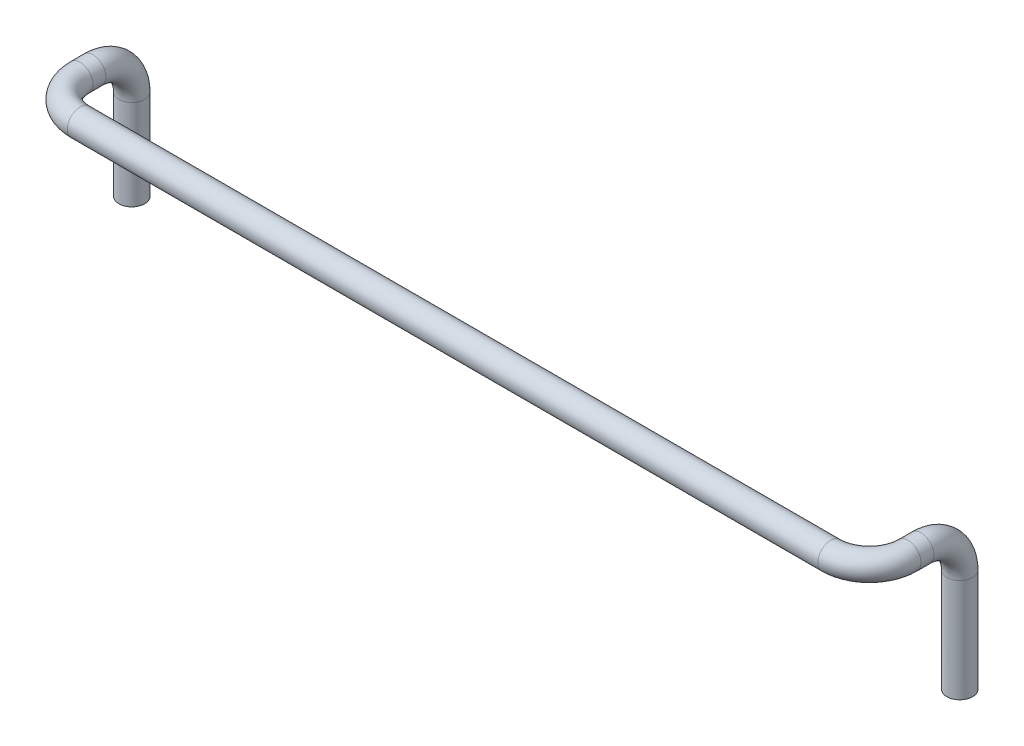
ISO-10303-21;
HEADER;
FILE_DESCRIPTION(('STEP AP214'),'2;1');
FILE_NAME('part.step','',(''),(''),'','','');
FILE_SCHEMA(('AUTOMOTIVE_DESIGN { 1 0 10303 214 1 1 1 1 }'));
ENDSEC;
DATA;
#1=APPLICATION_CONTEXT('core data for automotive mechanical design processes');
#2=APPLICATION_PROTOCOL_DEFINITION('international standard','automotive_design',2000,#1);
#3=PRODUCT_CONTEXT('',#1,'mechanical');
#4=PRODUCT('Part','Part','',(#3));
#5=PRODUCT_RELATED_PRODUCT_CATEGORY('part','',(#4));
#6=PRODUCT_DEFINITION_FORMATION('','',#4);
#7=PRODUCT_DEFINITION_CONTEXT('part definition',#1,'design');
#8=PRODUCT_DEFINITION('design','',#6,#7);
#9=PRODUCT_DEFINITION_SHAPE('','',#8);
#10=(LENGTH_UNIT() NAMED_UNIT(*) SI_UNIT(.MILLI.,.METRE.));
#11=(NAMED_UNIT(*) PLANE_ANGLE_UNIT() SI_UNIT($,.RADIAN.));
#12=(NAMED_UNIT(*) SI_UNIT($,.STERADIAN.) SOLID_ANGLE_UNIT());
#13=UNCERTAINTY_MEASURE_WITH_UNIT(LENGTH_MEASURE(1.E-05),#10,'distance_accuracy_value','');
#14=(GEOMETRIC_REPRESENTATION_CONTEXT(3) GLOBAL_UNCERTAINTY_ASSIGNED_CONTEXT((#13)) GLOBAL_UNIT_ASSIGNED_CONTEXT((#10,
#11,#12)) REPRESENTATION_CONTEXT('',''));
#15=CARTESIAN_POINT('',(0.,0.,0.));
#16=DIRECTION('',(0.,0.,1.));
#17=DIRECTION('',(1.,0.,0.));
#18=AXIS2_PLACEMENT_3D('',#15,#16,#17);
#19=CARTESIAN_POINT('',(63.1414630173547,-3.,-3.));
#20=DIRECTION('',(0.,-1.,0.));
#21=DIRECTION('',(0.,0.,-1.));
#22=AXIS2_PLACEMENT_3D('',#19,#20,#21);
#23=CYLINDRICAL_SURFACE('',#22,1.);
#24=CARTESIAN_POINT('',(63.1414630173547,-3.,-3.));
#25=DIRECTION('',(0.,-1.,0.));
#26=DIRECTION('',(0.,0.,1.));
#27=AXIS2_PLACEMENT_3D('',#24,#25,#26);
#28=CIRCLE('',#27,1.);
#29=CARTESIAN_POINT('',(63.1414630173547,-3.,-4.));
#30=VERTEX_POINT('',#29);
#31=EDGE_CURVE('E35',#30,#30,#28,.T.);
#32=ORIENTED_EDGE('',*,*,#31,.T.);
#33=EDGE_LOOP('',(#32));
#34=FACE_BOUND('',#33,.T.);
#35=CARTESIAN_POINT('',(63.1414630173547,-11.,-3.));
#36=DIRECTION('',(0.,-1.,0.));
#37=DIRECTION('',(0.,0.,1.));
#38=AXIS2_PLACEMENT_3D('',#35,#36,#37);
#39=CIRCLE('',#38,1.);
#40=CARTESIAN_POINT('',(63.1414630173547,-11.,-2.));
#41=VERTEX_POINT('',#40);
#42=EDGE_CURVE('E10',#41,#41,#39,.T.);
#43=ORIENTED_EDGE('',*,*,#42,.F.);
#44=EDGE_LOOP('',(#43));
#45=FACE_BOUND('',#44,.T.);
#46=ADVANCED_FACE('F29',(#34,#45),#23,.T.);
#47=CARTESIAN_POINT('',(63.1414630173547,-3.,0.));
#48=DIRECTION('',(-1.,0.,0.));
#49=DIRECTION('',(0.,0.,1.));
#50=AXIS2_PLACEMENT_3D('',#47,#48,#49);
#51=TOROIDAL_SURFACE('',#50,3.,1.);
#52=CARTESIAN_POINT('',(63.1414630173547,0.,0.));
#53=DIRECTION('',(0.,0.,-1.));
#54=DIRECTION('',(0.,-1.,0.));
#55=AXIS2_PLACEMENT_3D('',#52,#53,#54);
#56=CIRCLE('',#55,1.);
#57=CARTESIAN_POINT('',(63.1414630173547,1.,0.));
#58=VERTEX_POINT('',#57);
#59=EDGE_CURVE('E39',#58,#58,#56,.T.);
#60=CARTESIAN_POINT('',(63.1414630173547,-3.,0.));
#61=DIRECTION('',(-1.,0.,0.));
#62=DIRECTION('',(0.,0.,1.));
#63=AXIS2_PLACEMENT_3D('',#60,#61,#62);
#64=CIRCLE('',#63,4.);
#65=EDGE_CURVE('',#58,#30,#64,.T.);
#66=ORIENTED_EDGE('',*,*,#59,.T.);
#67=ORIENTED_EDGE('',*,*,#31,.F.);
#68=ORIENTED_EDGE('',*,*,#65,.T.);
#69=ORIENTED_EDGE('',*,*,#65,.F.);
#70=EDGE_LOOP('',(#66,#68,#67,#69));
#71=FACE_BOUND('',#70,.T.);
#72=ADVANCED_FACE('F85',(#71),#51,.T.);
#73=CARTESIAN_POINT('',(63.1414630173547,0.,1.));
#74=DIRECTION('',(0.,0.,-1.));
#75=DIRECTION('',(-1.,0.,0.));
#76=AXIS2_PLACEMENT_3D('',#73,#74,#75);
#77=CYLINDRICAL_SURFACE('',#76,1.);
#78=CARTESIAN_POINT('',(63.1414630173547,0.,1.));
#79=DIRECTION('',(0.,0.,-1.));
#80=DIRECTION('',(0.,-1.,0.));
#81=AXIS2_PLACEMENT_3D('',#78,#79,#80);
#82=CIRCLE('',#81,1.);
#83=CARTESIAN_POINT('',(64.1414630173547,0.,1.));
#84=VERTEX_POINT('',#83);
#85=EDGE_CURVE('E43',#84,#84,#82,.T.);
#86=ORIENTED_EDGE('',*,*,#85,.T.);
#87=EDGE_LOOP('',(#86));
#88=FACE_BOUND('',#87,.T.);
#89=ORIENTED_EDGE('',*,*,#59,.F.);
#90=EDGE_LOOP('',(#89));
#91=FACE_BOUND('',#90,.T.);
#92=ADVANCED_FACE('F89',(#88,#91),#77,.T.);
#93=CARTESIAN_POINT('',(60.1414630173547,0.,1.));
#94=DIRECTION('',(0.,1.,0.));
#95=DIRECTION('',(0.,0.,1.));
#96=AXIS2_PLACEMENT_3D('',#93,#94,#95);
#97=TOROIDAL_SURFACE('',#96,3.,1.);
#98=CARTESIAN_POINT('',(60.1414630173547,0.,4.));
#99=DIRECTION('',(1.,0.,0.));
#100=DIRECTION('',(0.,-1.,0.));
#101=AXIS2_PLACEMENT_3D('',#98,#99,#100);
#102=CIRCLE('',#101,1.);
#103=CARTESIAN_POINT('',(60.1414630173547,0.,5.));
#104=VERTEX_POINT('',#103);
#105=EDGE_CURVE('E48',#104,#104,#102,.T.);
#106=CARTESIAN_POINT('',(60.1414630173547,0.,1.));
#107=DIRECTION('',(0.,1.,0.));
#108=DIRECTION('',(0.,0.,1.));
#109=AXIS2_PLACEMENT_3D('',#106,#107,#108);
#110=CIRCLE('',#109,4.);
#111=EDGE_CURVE('',#104,#84,#110,.T.);
#112=ORIENTED_EDGE('',*,*,#105,.T.);
#113=ORIENTED_EDGE('',*,*,#85,.F.);
#114=ORIENTED_EDGE('',*,*,#111,.T.);
#115=ORIENTED_EDGE('',*,*,#111,.F.);
#116=EDGE_LOOP('',(#112,#114,#113,#115));
#117=FACE_BOUND('',#116,.T.);
#118=ADVANCED_FACE('F95',(#117),#97,.T.);
#119=CARTESIAN_POINT('',(2.,0.,4.));
#120=DIRECTION('',(1.,0.,0.));
#121=DIRECTION('',(0.,0.,-1.));
#122=AXIS2_PLACEMENT_3D('',#119,#120,#121);
#123=CYLINDRICAL_SURFACE('',#122,1.);
#124=CARTESIAN_POINT('',(2.,0.,4.));
#125=DIRECTION('',(1.,0.,0.));
#126=DIRECTION('',(0.,-1.,0.));
#127=AXIS2_PLACEMENT_3D('',#124,#125,#126);
#128=CIRCLE('',#127,1.);
#129=CARTESIAN_POINT('',(2.,0.,5.));
#130=VERTEX_POINT('',#129);
#131=EDGE_CURVE('E51',#130,#130,#128,.T.);
#132=ORIENTED_EDGE('',*,*,#131,.T.);
#133=EDGE_LOOP('',(#132));
#134=FACE_BOUND('',#133,.T.);
#135=ORIENTED_EDGE('',*,*,#105,.F.);
#136=EDGE_LOOP('',(#135));
#137=FACE_BOUND('',#136,.T.);
#138=ADVANCED_FACE('F102',(#134,#137),#123,.T.);
#139=CARTESIAN_POINT('',(2.,0.,1.));
#140=DIRECTION('',(0.,1.,0.));
#141=DIRECTION('',(0.,0.,1.));
#142=AXIS2_PLACEMENT_3D('',#139,#140,#141);
#143=TOROIDAL_SURFACE('',#142,3.,1.);
#144=CARTESIAN_POINT('',(-1.,0.,1.));
#145=DIRECTION('',(0.,0.,1.));
#146=DIRECTION('',(0.,-1.,0.));
#147=AXIS2_PLACEMENT_3D('',#144,#145,#146);
#148=CIRCLE('',#147,1.);
#149=CARTESIAN_POINT('',(-2.,0.,1.));
#150=VERTEX_POINT('',#149);
#151=EDGE_CURVE('E54',#150,#150,#148,.T.);
#152=CARTESIAN_POINT('',(2.,0.,1.));
#153=DIRECTION('',(0.,1.,0.));
#154=DIRECTION('',(0.,0.,1.));
#155=AXIS2_PLACEMENT_3D('',#152,#153,#154);
#156=CIRCLE('',#155,4.);
#157=EDGE_CURVE('',#150,#130,#156,.T.);
#158=ORIENTED_EDGE('',*,*,#151,.T.);
#159=ORIENTED_EDGE('',*,*,#131,.F.);
#160=ORIENTED_EDGE('',*,*,#157,.T.);
#161=ORIENTED_EDGE('',*,*,#157,.F.);
#162=EDGE_LOOP('',(#158,#160,#159,#161));
#163=FACE_BOUND('',#162,.T.);
#164=ADVANCED_FACE('F106',(#163),#143,.T.);
#165=CARTESIAN_POINT('',(-1.,0.,0.));
#166=DIRECTION('',(0.,0.,1.));
#167=DIRECTION('',(1.,0.,0.));
#168=AXIS2_PLACEMENT_3D('',#165,#166,#167);
#169=CYLINDRICAL_SURFACE('',#168,1.);
#170=CARTESIAN_POINT('',(-1.,0.,0.));
#171=DIRECTION('',(0.,0.,1.));
#172=DIRECTION('',(0.,-1.,0.));
#173=AXIS2_PLACEMENT_3D('',#170,#171,#172);
#174=CIRCLE('',#173,1.);
#175=CARTESIAN_POINT('',(-1.,1.,0.));
#176=VERTEX_POINT('',#175);
#177=EDGE_CURVE('E57',#176,#176,#174,.T.);
#178=ORIENTED_EDGE('',*,*,#177,.T.);
#179=EDGE_LOOP('',(#178));
#180=FACE_BOUND('',#179,.T.);
#181=ORIENTED_EDGE('',*,*,#151,.F.);
#182=EDGE_LOOP('',(#181));
#183=FACE_BOUND('',#182,.T.);
#184=ADVANCED_FACE('F110',(#180,#183),#169,.T.);
#185=CARTESIAN_POINT('',(-1.,-3.,0.));
#186=DIRECTION('',(1.,0.,0.));
#187=DIRECTION('',(0.,0.,-1.));
#188=AXIS2_PLACEMENT_3D('',#185,#186,#187);
#189=TOROIDAL_SURFACE('',#188,3.,1.);
#190=CARTESIAN_POINT('',(-1.,-3.,-3.));
#191=DIRECTION('',(0.,1.,0.));
#192=DIRECTION('',(0.,0.,1.));
#193=AXIS2_PLACEMENT_3D('',#190,#191,#192);
#194=CIRCLE('',#193,1.);
#195=CARTESIAN_POINT('',(-1.,-3.,-4.));
#196=VERTEX_POINT('',#195);
#197=EDGE_CURVE('E60',#196,#196,#194,.T.);
#198=CARTESIAN_POINT('',(-1.,-3.,0.));
#199=DIRECTION('',(1.,0.,0.));
#200=DIRECTION('',(0.,0.,-1.));
#201=AXIS2_PLACEMENT_3D('',#198,#199,#200);
#202=CIRCLE('',#201,4.);
#203=EDGE_CURVE('',#196,#176,#202,.T.);
#204=ORIENTED_EDGE('',*,*,#197,.T.);
#205=ORIENTED_EDGE('',*,*,#177,.F.);
#206=ORIENTED_EDGE('',*,*,#203,.T.);
#207=ORIENTED_EDGE('',*,*,#203,.F.);
#208=EDGE_LOOP('',(#204,#206,#205,#207));
#209=FACE_BOUND('',#208,.T.);
#210=ADVANCED_FACE('F67',(#209),#189,.T.);
#211=CARTESIAN_POINT('',(-1.,-3.,-3.));
#212=DIRECTION('',(0.,-1.,0.));
#213=DIRECTION('',(0.,0.,-1.));
#214=AXIS2_PLACEMENT_3D('',#211,#212,#213);
#215=CYLINDRICAL_SURFACE('',#214,1.);
#216=ORIENTED_EDGE('',*,*,#197,.F.);
#217=EDGE_LOOP('',(#216));
#218=FACE_BOUND('',#217,.T.);
#219=CARTESIAN_POINT('',(-1.,-10.,-3.));
#220=DIRECTION('',(0.,1.,0.));
#221=DIRECTION('',(0.,0.,1.));
#222=AXIS2_PLACEMENT_3D('',#219,#220,#221);
#223=CIRCLE('',#222,1.);
#224=CARTESIAN_POINT('',(-1.,-10.,-2.));
#225=VERTEX_POINT('',#224);
#226=EDGE_CURVE('E61',#225,#225,#223,.T.);
#227=ORIENTED_EDGE('',*,*,#226,.T.);
#228=EDGE_LOOP('',(#227));
#229=FACE_BOUND('',#228,.T.);
#230=ADVANCED_FACE('F70',(#218,#229),#215,.T.);
#231=CARTESIAN_POINT('',(63.1414630173547,-11.,-3.));
#232=DIRECTION('',(0.,-1.,0.));
#233=DIRECTION('',(0.,0.,1.));
#234=AXIS2_PLACEMENT_3D('',#231,#232,#233);
#235=PLANE('',#234);
#236=ORIENTED_EDGE('',*,*,#42,.T.);
#237=EDGE_LOOP('',(#236));
#238=FACE_BOUND('',#237,.T.);
#239=ADVANCED_FACE('F73',(#238),#235,.T.);
#240=CARTESIAN_POINT('',(-1.,-10.,-3.));
#241=DIRECTION('',(0.,1.,0.));
#242=DIRECTION('',(0.,0.,1.));
#243=AXIS2_PLACEMENT_3D('',#240,#241,#242);
#244=PLANE('',#243);
#245=ORIENTED_EDGE('',*,*,#226,.F.);
#246=EDGE_LOOP('',(#245));
#247=FACE_BOUND('',#246,.T.);
#248=ADVANCED_FACE('F77',(#247),#244,.F.);
#249=CLOSED_SHELL('',(#46,#72,#92,#118,#138,#164,#184,#210,#230,#239,#248));
#250=MANIFOLD_SOLID_BREP('B2',#249);
#251=ADVANCED_BREP_SHAPE_REPRESENTATION('',(#18,#250),#14);
#252=SHAPE_DEFINITION_REPRESENTATION(#9,#251);
ENDSEC;
END-ISO-10303-21;
